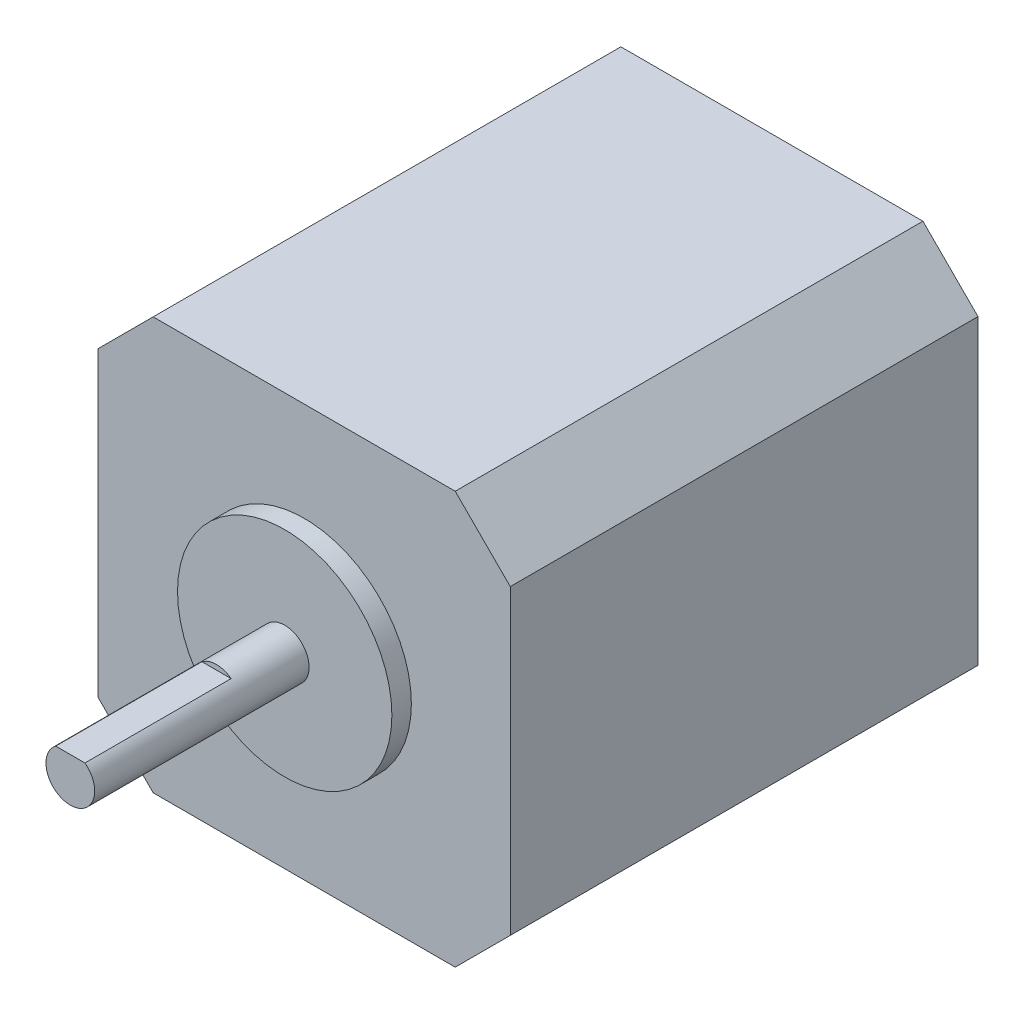
ISO-10303-21;
HEADER;
FILE_DESCRIPTION(('STEP AP214'),'2;1');
FILE_NAME('part.step','',(''),(''),'','','');
FILE_SCHEMA(('AUTOMOTIVE_DESIGN { 1 0 10303 214 1 1 1 1 }'));
ENDSEC;
DATA;
#1=APPLICATION_CONTEXT('core data for automotive mechanical design processes');
#2=APPLICATION_PROTOCOL_DEFINITION('international standard','automotive_design',2000,#1);
#3=PRODUCT_CONTEXT('',#1,'mechanical');
#4=PRODUCT('Part','Part','',(#3));
#5=PRODUCT_RELATED_PRODUCT_CATEGORY('part','',(#4));
#6=PRODUCT_DEFINITION_FORMATION('','',#4);
#7=PRODUCT_DEFINITION_CONTEXT('part definition',#1,'design');
#8=PRODUCT_DEFINITION('design','',#6,#7);
#9=PRODUCT_DEFINITION_SHAPE('','',#8);
#10=(LENGTH_UNIT() NAMED_UNIT(*) SI_UNIT(.MILLI.,.METRE.));
#11=(NAMED_UNIT(*) PLANE_ANGLE_UNIT() SI_UNIT($,.RADIAN.));
#12=(NAMED_UNIT(*) SI_UNIT($,.STERADIAN.) SOLID_ANGLE_UNIT());
#13=UNCERTAINTY_MEASURE_WITH_UNIT(LENGTH_MEASURE(1.E-05),#10,'distance_accuracy_value','');
#14=(GEOMETRIC_REPRESENTATION_CONTEXT(3) GLOBAL_UNCERTAINTY_ASSIGNED_CONTEXT((#13)) GLOBAL_UNIT_ASSIGNED_CONTEXT((#10,
#11,#12)) REPRESENTATION_CONTEXT('',''));
#15=CARTESIAN_POINT('',(0.,0.,0.));
#16=DIRECTION('',(0.,0.,1.));
#17=DIRECTION('',(1.,0.,0.));
#18=AXIS2_PLACEMENT_3D('',#15,#16,#17);
#19=CARTESIAN_POINT('',(21.15,21.15,72.));
#20=DIRECTION('',(0.,0.,-1.));
#21=DIRECTION('',(-1.,0.,0.));
#22=AXIS2_PLACEMENT_3D('',#19,#20,#21);
#23=CYLINDRICAL_SURFACE('',#22,2.5);
#24=CARTESIAN_POINT('',(21.15,21.15,50.));
#25=DIRECTION('',(0.,0.,1.));
#26=DIRECTION('',(1.,0.,0.));
#27=AXIS2_PLACEMENT_3D('',#24,#25,#26);
#28=CIRCLE('',#27,2.5);
#29=CARTESIAN_POINT('',(23.65,21.15,50.));
#30=VERTEX_POINT('',#29);
#31=EDGE_CURVE('E204',#30,#30,#28,.T.);
#32=ORIENTED_EDGE('',*,*,#31,.T.);
#33=EDGE_LOOP('',(#32));
#34=FACE_BOUND('',#33,.T.);
#35=DIRECTION('',(0.,0.,-1.));
#36=VECTOR('',#35,1.);
#37=CARTESIAN_POINT('',(22.65,23.15,72.));
#38=LINE('',#37,#36);
#39=CARTESIAN_POINT('',(22.65,23.15,72.));
#40=VERTEX_POINT('',#39);
#41=CARTESIAN_POINT('',(22.65,23.15,57.));
#42=VERTEX_POINT('',#41);
#43=EDGE_CURVE('E235',#40,#42,#38,.T.);
#44=ORIENTED_EDGE('',*,*,#43,.F.);
#45=CARTESIAN_POINT('',(21.15,21.15,72.));
#46=DIRECTION('',(0.,0.,1.));
#47=DIRECTION('',(1.,0.,0.));
#48=AXIS2_PLACEMENT_3D('',#45,#46,#47);
#49=CIRCLE('',#48,2.5);
#50=CARTESIAN_POINT('',(19.65,23.15,72.));
#51=VERTEX_POINT('',#50);
#52=EDGE_CURVE('E218',#51,#40,#49,.T.);
#53=ORIENTED_EDGE('',*,*,#52,.F.);
#54=DIRECTION('',(0.,0.,-1.));
#55=VECTOR('',#54,1.);
#56=CARTESIAN_POINT('',(19.65,23.15,72.));
#57=LINE('',#56,#55);
#58=CARTESIAN_POINT('',(19.65,23.15,57.));
#59=VERTEX_POINT('',#58);
#60=EDGE_CURVE('E59',#59,#51,#57,.F.);
#61=ORIENTED_EDGE('',*,*,#60,.F.);
#62=CARTESIAN_POINT('',(21.15,21.15,57.));
#63=DIRECTION('',(0.,0.,1.));
#64=DIRECTION('',(1.,0.,0.));
#65=AXIS2_PLACEMENT_3D('',#62,#63,#64);
#66=CIRCLE('',#65,2.5);
#67=EDGE_CURVE('E11',#42,#59,#66,.T.);
#68=ORIENTED_EDGE('',*,*,#67,.F.);
#69=EDGE_LOOP('',(#44,#53,#61,#68));
#70=FACE_BOUND('',#69,.T.);
#71=ADVANCED_FACE('F43',(#34,#70),#23,.T.);
#72=CARTESIAN_POINT('',(21.15,21.15,72.));
#73=DIRECTION('',(0.,0.,1.));
#74=DIRECTION('',(1.,0.,0.));
#75=AXIS2_PLACEMENT_3D('',#72,#73,#74);
#76=PLANE('',#75);
#77=ORIENTED_EDGE('',*,*,#52,.T.);
#78=DIRECTION('',(-1.,0.,0.));
#79=VECTOR('',#78,1.);
#80=CARTESIAN_POINT('',(21.15,23.15,72.));
#81=LINE('',#80,#79);
#82=EDGE_CURVE('E52',#40,#51,#81,.T.);
#83=ORIENTED_EDGE('',*,*,#82,.T.);
#84=EDGE_LOOP('',(#77,#83));
#85=FACE_BOUND('',#84,.T.);
#86=ADVANCED_FACE('F250',(#85),#76,.T.);
#87=CARTESIAN_POINT('',(36.65,0.,48.));
#88=DIRECTION('',(-0.707106781186547,0.707106781186548,0.));
#89=DIRECTION('',(-0.707106781186548,-0.707106781186547,0.));
#90=AXIS2_PLACEMENT_3D('',#87,#88,#89);
#91=PLANE('',#90);
#92=DIRECTION('',(0.707106781186548,0.707106781186547,0.));
#93=VECTOR('',#92,1.);
#94=CARTESIAN_POINT('',(36.65,0.,0.));
#95=LINE('',#94,#93);
#96=CARTESIAN_POINT('',(36.65,0.,0.));
#97=VERTEX_POINT('',#96);
#98=CARTESIAN_POINT('',(42.3,5.65,0.));
#99=VERTEX_POINT('',#98);
#100=EDGE_CURVE('E157',#97,#99,#95,.T.);
#101=ORIENTED_EDGE('',*,*,#100,.T.);
#102=DIRECTION('',(0.,0.,-1.));
#103=VECTOR('',#102,1.);
#104=CARTESIAN_POINT('',(42.3,5.65,48.));
#105=LINE('',#104,#103);
#106=CARTESIAN_POINT('',(42.3,5.65,48.));
#107=VERTEX_POINT('',#106);
#108=EDGE_CURVE('E200',#107,#99,#105,.T.);
#109=ORIENTED_EDGE('',*,*,#108,.F.);
#110=DIRECTION('',(0.707106781186548,0.707106781186547,0.));
#111=VECTOR('',#110,1.);
#112=CARTESIAN_POINT('',(36.65,0.,48.));
#113=LINE('',#112,#111);
#114=CARTESIAN_POINT('',(36.65,0.,48.));
#115=VERTEX_POINT('',#114);
#116=EDGE_CURVE('E181',#115,#107,#113,.T.);
#117=ORIENTED_EDGE('',*,*,#116,.F.);
#118=DIRECTION('',(0.,0.,-1.));
#119=VECTOR('',#118,1.);
#120=CARTESIAN_POINT('',(36.65,0.,48.));
#121=LINE('',#120,#119);
#122=EDGE_CURVE('E153',#115,#97,#121,.T.);
#123=ORIENTED_EDGE('',*,*,#122,.T.);
#124=EDGE_LOOP('',(#101,#109,#117,#123));
#125=FACE_BOUND('',#124,.T.);
#126=ADVANCED_FACE('F45',(#125),#91,.F.);
#127=CARTESIAN_POINT('',(42.3,5.65,48.));
#128=DIRECTION('',(-1.,0.,0.));
#129=DIRECTION('',(0.,0.,1.));
#130=AXIS2_PLACEMENT_3D('',#127,#128,#129);
#131=PLANE('',#130);
#132=DIRECTION('',(0.,1.,0.));
#133=VECTOR('',#132,1.);
#134=CARTESIAN_POINT('',(42.3,5.65,0.));
#135=LINE('',#134,#133);
#136=CARTESIAN_POINT('',(42.3,36.65,0.));
#137=VERTEX_POINT('',#136);
#138=EDGE_CURVE('E161',#99,#137,#135,.T.);
#139=ORIENTED_EDGE('',*,*,#138,.T.);
#140=DIRECTION('',(0.,0.,-1.));
#141=VECTOR('',#140,1.);
#142=CARTESIAN_POINT('',(42.3,36.65,48.));
#143=LINE('',#142,#141);
#144=CARTESIAN_POINT('',(42.3,36.65,48.));
#145=VERTEX_POINT('',#144);
#146=EDGE_CURVE('E196',#145,#137,#143,.T.);
#147=ORIENTED_EDGE('',*,*,#146,.F.);
#148=DIRECTION('',(0.,1.,0.));
#149=VECTOR('',#148,1.);
#150=CARTESIAN_POINT('',(42.3,5.65,48.));
#151=LINE('',#150,#149);
#152=EDGE_CURVE('E110',#107,#145,#151,.T.);
#153=ORIENTED_EDGE('',*,*,#152,.F.);
#154=ORIENTED_EDGE('',*,*,#108,.T.);
#155=EDGE_LOOP('',(#139,#147,#153,#154));
#156=FACE_BOUND('',#155,.T.);
#157=ADVANCED_FACE('F258',(#156),#131,.F.);
#158=CARTESIAN_POINT('',(36.65,42.3,48.));
#159=DIRECTION('',(-0.707106781186548,-0.707106781186548,0.));
#160=DIRECTION('',(0.707106781186548,-0.707106781186548,0.));
#161=AXIS2_PLACEMENT_3D('',#158,#159,#160);
#162=PLANE('',#161);
#163=DIRECTION('',(-0.707106781186547,0.707106781186547,0.));
#164=VECTOR('',#163,1.);
#165=CARTESIAN_POINT('',(36.65,42.3,0.));
#166=LINE('',#165,#164);
#167=CARTESIAN_POINT('',(36.65,42.3,0.));
#168=VERTEX_POINT('',#167);
#169=EDGE_CURVE('E165',#137,#168,#166,.T.);
#170=ORIENTED_EDGE('',*,*,#169,.T.);
#171=DIRECTION('',(0.,0.,-1.));
#172=VECTOR('',#171,1.);
#173=CARTESIAN_POINT('',(36.65,42.3,48.));
#174=LINE('',#173,#172);
#175=CARTESIAN_POINT('',(36.65,42.3,48.));
#176=VERTEX_POINT('',#175);
#177=EDGE_CURVE('E192',#176,#168,#174,.T.);
#178=ORIENTED_EDGE('',*,*,#177,.F.);
#179=DIRECTION('',(-0.707106781186547,0.707106781186547,0.));
#180=VECTOR('',#179,1.);
#181=CARTESIAN_POINT('',(36.65,42.3,48.));
#182=LINE('',#181,#180);
#183=EDGE_CURVE('E227',#145,#176,#182,.T.);
#184=ORIENTED_EDGE('',*,*,#183,.F.);
#185=ORIENTED_EDGE('',*,*,#146,.T.);
#186=EDGE_LOOP('',(#170,#178,#184,#185));
#187=FACE_BOUND('',#186,.T.);
#188=ADVANCED_FACE('F294',(#187),#162,.F.);
#189=CARTESIAN_POINT('',(5.65,42.3,48.));
#190=DIRECTION('',(0.,-1.,0.));
#191=DIRECTION('',(0.,0.,-1.));
#192=AXIS2_PLACEMENT_3D('',#189,#190,#191);
#193=PLANE('',#192);
#194=DIRECTION('',(-1.,0.,0.));
#195=VECTOR('',#194,1.);
#196=CARTESIAN_POINT('',(5.65,42.3,0.));
#197=LINE('',#196,#195);
#198=CARTESIAN_POINT('',(5.65,42.3,0.));
#199=VERTEX_POINT('',#198);
#200=EDGE_CURVE('E168',#168,#199,#197,.T.);
#201=ORIENTED_EDGE('',*,*,#200,.T.);
#202=DIRECTION('',(0.,0.,-1.));
#203=VECTOR('',#202,1.);
#204=CARTESIAN_POINT('',(5.65,42.3,48.));
#205=LINE('',#204,#203);
#206=CARTESIAN_POINT('',(5.65,42.3,48.));
#207=VERTEX_POINT('',#206);
#208=EDGE_CURVE('E188',#207,#199,#205,.T.);
#209=ORIENTED_EDGE('',*,*,#208,.F.);
#210=DIRECTION('',(-1.,0.,0.));
#211=VECTOR('',#210,1.);
#212=CARTESIAN_POINT('',(5.65,42.3,48.));
#213=LINE('',#212,#211);
#214=EDGE_CURVE('E230',#176,#207,#213,.T.);
#215=ORIENTED_EDGE('',*,*,#214,.F.);
#216=ORIENTED_EDGE('',*,*,#177,.T.);
#217=EDGE_LOOP('',(#201,#209,#215,#216));
#218=FACE_BOUND('',#217,.T.);
#219=ADVANCED_FACE('F290',(#218),#193,.F.);
#220=CARTESIAN_POINT('',(0.,36.65,48.));
#221=DIRECTION('',(0.707106781186548,-0.707106781186547,0.));
#222=DIRECTION('',(0.707106781186547,0.707106781186548,0.));
#223=AXIS2_PLACEMENT_3D('',#220,#221,#222);
#224=PLANE('',#223);
#225=DIRECTION('',(-0.707106781186547,-0.707106781186548,0.));
#226=VECTOR('',#225,1.);
#227=CARTESIAN_POINT('',(0.,36.65,0.));
#228=LINE('',#227,#226);
#229=CARTESIAN_POINT('',(0.,36.65,0.));
#230=VERTEX_POINT('',#229);
#231=EDGE_CURVE('E171',#199,#230,#228,.T.);
#232=ORIENTED_EDGE('',*,*,#231,.T.);
#233=DIRECTION('',(0.,0.,-1.));
#234=VECTOR('',#233,1.);
#235=CARTESIAN_POINT('',(0.,36.65,48.));
#236=LINE('',#235,#234);
#237=CARTESIAN_POINT('',(0.,36.65,48.));
#238=VERTEX_POINT('',#237);
#239=EDGE_CURVE('E146',#238,#230,#236,.T.);
#240=ORIENTED_EDGE('',*,*,#239,.F.);
#241=DIRECTION('',(-0.707106781186547,-0.707106781186548,0.));
#242=VECTOR('',#241,1.);
#243=CARTESIAN_POINT('',(0.,36.65,48.));
#244=LINE('',#243,#242);
#245=EDGE_CURVE('E132',#207,#238,#244,.T.);
#246=ORIENTED_EDGE('',*,*,#245,.F.);
#247=ORIENTED_EDGE('',*,*,#208,.T.);
#248=EDGE_LOOP('',(#232,#240,#246,#247));
#249=FACE_BOUND('',#248,.T.);
#250=ADVANCED_FACE('F287',(#249),#224,.F.);
#251=CARTESIAN_POINT('',(0.,5.65,48.));
#252=DIRECTION('',(1.,0.,0.));
#253=DIRECTION('',(0.,1.,0.));
#254=AXIS2_PLACEMENT_3D('',#251,#252,#253);
#255=PLANE('',#254);
#256=DIRECTION('',(0.,-1.,0.));
#257=VECTOR('',#256,1.);
#258=CARTESIAN_POINT('',(0.,5.65,0.));
#259=LINE('',#258,#257);
#260=CARTESIAN_POINT('',(0.,5.65,0.));
#261=VERTEX_POINT('',#260);
#262=EDGE_CURVE('E142',#230,#261,#259,.T.);
#263=ORIENTED_EDGE('',*,*,#262,.T.);
#264=DIRECTION('',(0.,0.,-1.));
#265=VECTOR('',#264,1.);
#266=CARTESIAN_POINT('',(0.,5.65,48.));
#267=LINE('',#266,#265);
#268=CARTESIAN_POINT('',(0.,5.65,48.));
#269=VERTEX_POINT('',#268);
#270=EDGE_CURVE('E139',#269,#261,#267,.T.);
#271=ORIENTED_EDGE('',*,*,#270,.F.);
#272=DIRECTION('',(0.,-1.,0.));
#273=VECTOR('',#272,1.);
#274=CARTESIAN_POINT('',(0.,5.65,48.));
#275=LINE('',#274,#273);
#276=EDGE_CURVE('E125',#238,#269,#275,.T.);
#277=ORIENTED_EDGE('',*,*,#276,.F.);
#278=ORIENTED_EDGE('',*,*,#239,.T.);
#279=EDGE_LOOP('',(#263,#271,#277,#278));
#280=FACE_BOUND('',#279,.T.);
#281=ADVANCED_FACE('F140',(#280),#255,.F.);
#282=CARTESIAN_POINT('',(0.,5.65,48.));
#283=DIRECTION('',(0.707106781186547,0.707106781186548,0.));
#284=DIRECTION('',(-0.707106781186548,0.707106781186547,0.));
#285=AXIS2_PLACEMENT_3D('',#282,#283,#284);
#286=PLANE('',#285);
#287=DIRECTION('',(0.707106781186548,-0.707106781186547,0.));
#288=VECTOR('',#287,1.);
#289=CARTESIAN_POINT('',(0.,5.65,0.));
#290=LINE('',#289,#288);
#291=CARTESIAN_POINT('',(5.65,0.,0.));
#292=VERTEX_POINT('',#291);
#293=EDGE_CURVE('E176',#261,#292,#290,.T.);
#294=ORIENTED_EDGE('',*,*,#293,.T.);
#295=DIRECTION('',(0.,0.,-1.));
#296=VECTOR('',#295,1.);
#297=CARTESIAN_POINT('',(5.65,0.,48.));
#298=LINE('',#297,#296);
#299=CARTESIAN_POINT('',(5.65,0.,48.));
#300=VERTEX_POINT('',#299);
#301=EDGE_CURVE('E147',#300,#292,#298,.T.);
#302=ORIENTED_EDGE('',*,*,#301,.F.);
#303=DIRECTION('',(0.707106781186548,-0.707106781186547,0.));
#304=VECTOR('',#303,1.);
#305=CARTESIAN_POINT('',(0.,5.65,48.));
#306=LINE('',#305,#304);
#307=EDGE_CURVE('E129',#269,#300,#306,.T.);
#308=ORIENTED_EDGE('',*,*,#307,.F.);
#309=ORIENTED_EDGE('',*,*,#270,.T.);
#310=EDGE_LOOP('',(#294,#302,#308,#309));
#311=FACE_BOUND('',#310,.T.);
#312=ADVANCED_FACE('F149',(#311),#286,.F.);
#313=CARTESIAN_POINT('',(5.65,0.,48.));
#314=DIRECTION('',(0.,1.,0.));
#315=DIRECTION('',(0.,0.,1.));
#316=AXIS2_PLACEMENT_3D('',#313,#314,#315);
#317=PLANE('',#316);
#318=DIRECTION('',(1.,0.,0.));
#319=VECTOR('',#318,1.);
#320=CARTESIAN_POINT('',(5.65,0.,0.));
#321=LINE('',#320,#319);
#322=EDGE_CURVE('E101',#292,#97,#321,.T.);
#323=ORIENTED_EDGE('',*,*,#322,.T.);
#324=ORIENTED_EDGE('',*,*,#122,.F.);
#325=DIRECTION('',(1.,0.,0.));
#326=VECTOR('',#325,1.);
#327=CARTESIAN_POINT('',(5.65,0.,48.));
#328=LINE('',#327,#326);
#329=EDGE_CURVE('E68',#300,#115,#328,.T.);
#330=ORIENTED_EDGE('',*,*,#329,.F.);
#331=ORIENTED_EDGE('',*,*,#301,.T.);
#332=EDGE_LOOP('',(#323,#324,#330,#331));
#333=FACE_BOUND('',#332,.T.);
#334=ADVANCED_FACE('F276',(#333),#317,.F.);
#335=CARTESIAN_POINT('',(0.,0.,48.));
#336=DIRECTION('',(0.,0.,-1.));
#337=DIRECTION('',(-1.,0.,0.));
#338=AXIS2_PLACEMENT_3D('',#335,#336,#337);
#339=PLANE('',#338);
#340=CARTESIAN_POINT('',(21.15,21.15,48.));
#341=DIRECTION('',(0.,0.,1.));
#342=DIRECTION('',(1.,0.,0.));
#343=AXIS2_PLACEMENT_3D('',#340,#341,#342);
#344=CIRCLE('',#343,11.);
#345=CARTESIAN_POINT('',(32.15,21.15,48.));
#346=VERTEX_POINT('',#345);
#347=EDGE_CURVE('E202',#346,#346,#344,.T.);
#348=ORIENTED_EDGE('',*,*,#347,.F.);
#349=EDGE_LOOP('',(#348));
#350=FACE_BOUND('',#349,.T.);
#351=ORIENTED_EDGE('',*,*,#116,.T.);
#352=ORIENTED_EDGE('',*,*,#152,.T.);
#353=ORIENTED_EDGE('',*,*,#183,.T.);
#354=ORIENTED_EDGE('',*,*,#214,.T.);
#355=ORIENTED_EDGE('',*,*,#245,.T.);
#356=ORIENTED_EDGE('',*,*,#276,.T.);
#357=ORIENTED_EDGE('',*,*,#307,.T.);
#358=ORIENTED_EDGE('',*,*,#329,.T.);
#359=EDGE_LOOP('',(#351,#352,#353,#354,#355,#356,#357,#358));
#360=FACE_BOUND('',#359,.T.);
#361=ADVANCED_FACE('F127',(#350,#360),#339,.F.);
#362=CARTESIAN_POINT('',(0.,0.,0.));
#363=DIRECTION('',(0.,0.,-1.));
#364=DIRECTION('',(-1.,0.,0.));
#365=AXIS2_PLACEMENT_3D('',#362,#363,#364);
#366=PLANE('',#365);
#367=ORIENTED_EDGE('',*,*,#100,.F.);
#368=ORIENTED_EDGE('',*,*,#322,.F.);
#369=ORIENTED_EDGE('',*,*,#293,.F.);
#370=ORIENTED_EDGE('',*,*,#262,.F.);
#371=ORIENTED_EDGE('',*,*,#231,.F.);
#372=ORIENTED_EDGE('',*,*,#200,.F.);
#373=ORIENTED_EDGE('',*,*,#169,.F.);
#374=ORIENTED_EDGE('',*,*,#138,.F.);
#375=EDGE_LOOP('',(#367,#368,#369,#370,#371,#372,#373,#374));
#376=FACE_BOUND('',#375,.T.);
#377=ADVANCED_FACE('F272',(#376),#366,.T.);
#378=CARTESIAN_POINT('',(21.15,21.15,50.));
#379=DIRECTION('',(0.,0.,-1.));
#380=DIRECTION('',(-1.,0.,0.));
#381=AXIS2_PLACEMENT_3D('',#378,#379,#380);
#382=CYLINDRICAL_SURFACE('',#381,11.);
#383=CARTESIAN_POINT('',(21.15,21.15,50.));
#384=DIRECTION('',(0.,0.,1.));
#385=DIRECTION('',(1.,0.,0.));
#386=AXIS2_PLACEMENT_3D('',#383,#384,#385);
#387=CIRCLE('',#386,11.);
#388=CARTESIAN_POINT('',(32.15,21.15,50.));
#389=VERTEX_POINT('',#388);
#390=EDGE_CURVE('E162',#389,#389,#387,.T.);
#391=ORIENTED_EDGE('',*,*,#390,.F.);
#392=EDGE_LOOP('',(#391));
#393=FACE_BOUND('',#392,.T.);
#394=ORIENTED_EDGE('',*,*,#347,.T.);
#395=EDGE_LOOP('',(#394));
#396=FACE_BOUND('',#395,.T.);
#397=ADVANCED_FACE('F268',(#393,#396),#382,.T.);
#398=CARTESIAN_POINT('',(21.15,21.15,50.));
#399=DIRECTION('',(0.,0.,1.));
#400=DIRECTION('',(1.,0.,0.));
#401=AXIS2_PLACEMENT_3D('',#398,#399,#400);
#402=PLANE('',#401);
#403=ORIENTED_EDGE('',*,*,#31,.F.);
#404=EDGE_LOOP('',(#403));
#405=FACE_BOUND('',#404,.T.);
#406=ORIENTED_EDGE('',*,*,#390,.T.);
#407=EDGE_LOOP('',(#406));
#408=FACE_BOUND('',#407,.T.);
#409=ADVANCED_FACE('F264',(#405,#408),#402,.T.);
#410=CARTESIAN_POINT('',(0.,0.,57.));
#411=DIRECTION('',(0.,0.,1.));
#412=DIRECTION('',(1.,0.,0.));
#413=AXIS2_PLACEMENT_3D('',#410,#411,#412);
#414=PLANE('',#413);
#415=ORIENTED_EDGE('',*,*,#67,.T.);
#416=DIRECTION('',(-1.,0.,0.));
#417=VECTOR('',#416,1.);
#418=CARTESIAN_POINT('',(0.,23.15,57.));
#419=LINE('',#418,#417);
#420=EDGE_CURVE('E239',#42,#59,#419,.T.);
#421=ORIENTED_EDGE('',*,*,#420,.F.);
#422=EDGE_LOOP('',(#415,#421));
#423=FACE_BOUND('',#422,.T.);
#424=ADVANCED_FACE('F267',(#423),#414,.T.);
#425=CARTESIAN_POINT('',(0.,23.15,57.));
#426=DIRECTION('',(0.,1.,0.));
#427=DIRECTION('',(0.,0.,1.));
#428=AXIS2_PLACEMENT_3D('',#425,#426,#427);
#429=PLANE('',#428);
#430=ORIENTED_EDGE('',*,*,#43,.T.);
#431=ORIENTED_EDGE('',*,*,#420,.T.);
#432=ORIENTED_EDGE('',*,*,#60,.T.);
#433=ORIENTED_EDGE('',*,*,#82,.F.);
#434=EDGE_LOOP('',(#430,#431,#432,#433));
#435=FACE_BOUND('',#434,.T.);
#436=ADVANCED_FACE('F243',(#435),#429,.T.);
#437=CLOSED_SHELL('',(#71,#86,#126,#157,#188,#219,#250,#281,#312,#334,#361,#377,#397,#409,#424,#436));
#438=MANIFOLD_SOLID_BREP('B2',#437);
#439=ADVANCED_BREP_SHAPE_REPRESENTATION('',(#18,#438),#14);
#440=SHAPE_DEFINITION_REPRESENTATION(#9,#439);
ENDSEC;
END-ISO-10303-21;
